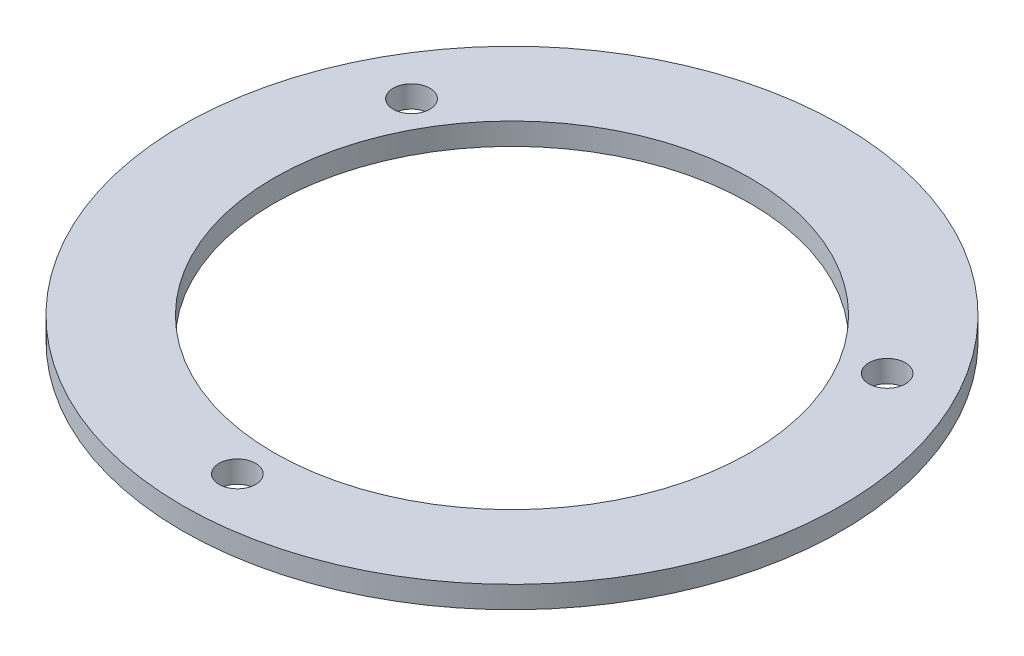
ISO-10303-21;
HEADER;
FILE_DESCRIPTION(('STEP AP214'),'2;1');
FILE_NAME('part.step','',(''),(''),'','','');
FILE_SCHEMA(('AUTOMOTIVE_DESIGN { 1 0 10303 214 1 1 1 1 }'));
ENDSEC;
DATA;
#1=APPLICATION_CONTEXT('core data for automotive mechanical design processes');
#2=APPLICATION_PROTOCOL_DEFINITION('international standard','automotive_design',2000,#1);
#3=PRODUCT_CONTEXT('',#1,'mechanical');
#4=PRODUCT('Part','Part','',(#3));
#5=PRODUCT_RELATED_PRODUCT_CATEGORY('part','',(#4));
#6=PRODUCT_DEFINITION_FORMATION('','',#4);
#7=PRODUCT_DEFINITION_CONTEXT('part definition',#1,'design');
#8=PRODUCT_DEFINITION('design','',#6,#7);
#9=PRODUCT_DEFINITION_SHAPE('','',#8);
#10=(LENGTH_UNIT() NAMED_UNIT(*) SI_UNIT(.MILLI.,.METRE.));
#11=(NAMED_UNIT(*) PLANE_ANGLE_UNIT() SI_UNIT($,.RADIAN.));
#12=(NAMED_UNIT(*) SI_UNIT($,.STERADIAN.) SOLID_ANGLE_UNIT());
#13=UNCERTAINTY_MEASURE_WITH_UNIT(LENGTH_MEASURE(1.E-05),#10,'distance_accuracy_value','');
#14=(GEOMETRIC_REPRESENTATION_CONTEXT(3) GLOBAL_UNCERTAINTY_ASSIGNED_CONTEXT((#13)) GLOBAL_UNIT_ASSIGNED_CONTEXT((#10,
#11,#12)) REPRESENTATION_CONTEXT('',''));
#15=CARTESIAN_POINT('',(0.,0.,0.));
#16=DIRECTION('',(0.,0.,1.));
#17=DIRECTION('',(1.,0.,0.));
#18=AXIS2_PLACEMENT_3D('',#15,#16,#17);
#19=CARTESIAN_POINT('',(0.,63.5,0.));
#20=DIRECTION('',(0.,-1.,0.));
#21=DIRECTION('',(0.,0.,-1.));
#22=AXIS2_PLACEMENT_3D('',#19,#20,#21);
#23=CYLINDRICAL_SURFACE('',#22,57.15);
#24=CARTESIAN_POINT('',(0.,59.69,0.));
#25=DIRECTION('',(0.,1.,0.));
#26=DIRECTION('',(0.,0.,1.));
#27=AXIS2_PLACEMENT_3D('',#24,#25,#26);
#28=CIRCLE('',#27,57.15);
#29=CARTESIAN_POINT('',(0.,59.69,57.15));
#30=VERTEX_POINT('',#29);
#31=EDGE_CURVE('E69',#30,#30,#28,.T.);
#32=ORIENTED_EDGE('',*,*,#31,.T.);
#33=EDGE_LOOP('',(#32));
#34=FACE_BOUND('',#33,.T.);
#35=CARTESIAN_POINT('',(0.,63.5,0.));
#36=DIRECTION('',(0.,1.,0.));
#37=DIRECTION('',(0.,0.,1.));
#38=AXIS2_PLACEMENT_3D('',#35,#36,#37);
#39=CIRCLE('',#38,57.15);
#40=CARTESIAN_POINT('',(0.,63.5,57.15));
#41=VERTEX_POINT('',#40);
#42=EDGE_CURVE('E11',#41,#41,#39,.T.);
#43=ORIENTED_EDGE('',*,*,#42,.F.);
#44=EDGE_LOOP('',(#43));
#45=FACE_BOUND('',#44,.T.);
#46=ADVANCED_FACE('F42',(#34,#45),#23,.T.);
#47=CARTESIAN_POINT('',(0.,63.5,0.));
#48=DIRECTION('',(0.,1.,0.));
#49=DIRECTION('',(0.,0.,1.));
#50=AXIS2_PLACEMENT_3D('',#47,#48,#49);
#51=PLANE('',#50);
#52=CARTESIAN_POINT('',(-41.2444598552339,63.5,-23.8125));
#53=DIRECTION('',(0.,1.,0.));
#54=DIRECTION('',(0.,0.,1.));
#55=AXIS2_PLACEMENT_3D('',#52,#53,#54);
#56=CIRCLE('',#55,3.17499999999999);
#57=CARTESIAN_POINT('',(-41.2444598552339,63.5,-20.6375));
#58=VERTEX_POINT('',#57);
#59=EDGE_CURVE('E65',#58,#58,#56,.T.);
#60=ORIENTED_EDGE('',*,*,#59,.F.);
#61=EDGE_LOOP('',(#60));
#62=FACE_BOUND('',#61,.T.);
#63=CARTESIAN_POINT('',(0.,63.5,47.625));
#64=DIRECTION('',(0.,1.,0.));
#65=DIRECTION('',(0.,0.,1.));
#66=AXIS2_PLACEMENT_3D('',#63,#64,#65);
#67=CIRCLE('',#66,3.17499999999999);
#68=CARTESIAN_POINT('',(0.,63.5,50.8));
#69=VERTEX_POINT('',#68);
#70=EDGE_CURVE('E61',#69,#69,#67,.T.);
#71=ORIENTED_EDGE('',*,*,#70,.F.);
#72=EDGE_LOOP('',(#71));
#73=FACE_BOUND('',#72,.T.);
#74=CARTESIAN_POINT('',(41.2444598552339,63.5,-23.8125));
#75=DIRECTION('',(0.,1.,0.));
#76=DIRECTION('',(0.,0.,1.));
#77=AXIS2_PLACEMENT_3D('',#74,#75,#76);
#78=CIRCLE('',#77,3.17499999999999);
#79=CARTESIAN_POINT('',(41.2444598552339,63.5,-20.6375));
#80=VERTEX_POINT('',#79);
#81=EDGE_CURVE('E55',#80,#80,#78,.T.);
#82=ORIENTED_EDGE('',*,*,#81,.F.);
#83=EDGE_LOOP('',(#82));
#84=FACE_BOUND('',#83,.T.);
#85=CARTESIAN_POINT('',(0.,63.5,0.));
#86=DIRECTION('',(0.,1.,0.));
#87=DIRECTION('',(0.,0.,1.));
#88=AXIS2_PLACEMENT_3D('',#85,#86,#87);
#89=CIRCLE('',#88,41.275);
#90=CARTESIAN_POINT('',(0.,63.5,41.275));
#91=VERTEX_POINT('',#90);
#92=EDGE_CURVE('E50',#91,#91,#89,.T.);
#93=ORIENTED_EDGE('',*,*,#92,.F.);
#94=EDGE_LOOP('',(#93));
#95=FACE_BOUND('',#94,.T.);
#96=ORIENTED_EDGE('',*,*,#42,.T.);
#97=EDGE_LOOP('',(#96));
#98=FACE_BOUND('',#97,.T.);
#99=ADVANCED_FACE('F104',(#62,#73,#84,#95,#98),#51,.T.);
#100=CARTESIAN_POINT('',(0.,-116.743329573899,0.));
#101=DIRECTION('',(0.,1.,0.));
#102=DIRECTION('',(0.,0.,1.));
#103=AXIS2_PLACEMENT_3D('',#100,#101,#102);
#104=CYLINDRICAL_SURFACE('',#103,41.275);
#105=CARTESIAN_POINT('',(0.,59.69,0.));
#106=DIRECTION('',(0.,1.,0.));
#107=DIRECTION('',(0.,0.,1.));
#108=AXIS2_PLACEMENT_3D('',#105,#106,#107);
#109=CIRCLE('',#108,41.275);
#110=CARTESIAN_POINT('',(0.,59.69,41.275));
#111=VERTEX_POINT('',#110);
#112=EDGE_CURVE('E73',#111,#111,#109,.F.);
#113=ORIENTED_EDGE('',*,*,#112,.T.);
#114=EDGE_LOOP('',(#113));
#115=FACE_BOUND('',#114,.T.);
#116=ORIENTED_EDGE('',*,*,#92,.T.);
#117=EDGE_LOOP('',(#116));
#118=FACE_BOUND('',#117,.T.);
#119=ADVANCED_FACE('F110',(#115,#118),#104,.F.);
#120=CARTESIAN_POINT('',(41.2444598552339,63.5,-23.8125));
#121=DIRECTION('',(0.,1.,0.));
#122=DIRECTION('',(0.,0.,1.));
#123=AXIS2_PLACEMENT_3D('',#120,#121,#122);
#124=CYLINDRICAL_SURFACE('',#123,3.17499999999999);
#125=CARTESIAN_POINT('',(41.2444598552339,59.69,-23.8125));
#126=DIRECTION('',(0.,1.,0.));
#127=DIRECTION('',(0.,0.,1.));
#128=AXIS2_PLACEMENT_3D('',#125,#126,#127);
#129=CIRCLE('',#128,3.17499999999999);
#130=CARTESIAN_POINT('',(41.2444598552339,59.69,-20.6375));
#131=VERTEX_POINT('',#130);
#132=EDGE_CURVE('E77',#131,#131,#129,.F.);
#133=ORIENTED_EDGE('',*,*,#132,.T.);
#134=EDGE_LOOP('',(#133));
#135=FACE_BOUND('',#134,.T.);
#136=ORIENTED_EDGE('',*,*,#81,.T.);
#137=EDGE_LOOP('',(#136));
#138=FACE_BOUND('',#137,.T.);
#139=ADVANCED_FACE('F115',(#135,#138),#124,.F.);
#140=CARTESIAN_POINT('',(0.,63.5,47.625));
#141=DIRECTION('',(0.,1.,0.));
#142=DIRECTION('',(0.,0.,1.));
#143=AXIS2_PLACEMENT_3D('',#140,#141,#142);
#144=CYLINDRICAL_SURFACE('',#143,3.17499999999999);
#145=CARTESIAN_POINT('',(0.,59.69,47.625));
#146=DIRECTION('',(0.,1.,0.));
#147=DIRECTION('',(0.,0.,1.));
#148=AXIS2_PLACEMENT_3D('',#145,#146,#147);
#149=CIRCLE('',#148,3.17499999999999);
#150=CARTESIAN_POINT('',(0.,59.69,50.8));
#151=VERTEX_POINT('',#150);
#152=EDGE_CURVE('E81',#151,#151,#149,.F.);
#153=ORIENTED_EDGE('',*,*,#152,.T.);
#154=EDGE_LOOP('',(#153));
#155=FACE_BOUND('',#154,.T.);
#156=ORIENTED_EDGE('',*,*,#70,.T.);
#157=EDGE_LOOP('',(#156));
#158=FACE_BOUND('',#157,.T.);
#159=ADVANCED_FACE('F123',(#155,#158),#144,.F.);
#160=CARTESIAN_POINT('',(-41.2444598552339,63.5,-23.8125));
#161=DIRECTION('',(0.,1.,0.));
#162=DIRECTION('',(0.,0.,1.));
#163=AXIS2_PLACEMENT_3D('',#160,#161,#162);
#164=CYLINDRICAL_SURFACE('',#163,3.17499999999999);
#165=CARTESIAN_POINT('',(-41.2444598552339,59.69,-23.8125));
#166=DIRECTION('',(0.,1.,0.));
#167=DIRECTION('',(0.,0.,1.));
#168=AXIS2_PLACEMENT_3D('',#165,#166,#167);
#169=CIRCLE('',#168,3.17499999999999);
#170=CARTESIAN_POINT('',(-41.2444598552339,59.69,-20.6375));
#171=VERTEX_POINT('',#170);
#172=EDGE_CURVE('E45',#171,#171,#169,.F.);
#173=ORIENTED_EDGE('',*,*,#172,.T.);
#174=EDGE_LOOP('',(#173));
#175=FACE_BOUND('',#174,.T.);
#176=ORIENTED_EDGE('',*,*,#59,.T.);
#177=EDGE_LOOP('',(#176));
#178=FACE_BOUND('',#177,.T.);
#179=ADVANCED_FACE('F90',(#175,#178),#164,.F.);
#180=CARTESIAN_POINT('',(0.,59.69,0.));
#181=DIRECTION('',(0.,1.,0.));
#182=DIRECTION('',(0.,0.,1.));
#183=AXIS2_PLACEMENT_3D('',#180,#181,#182);
#184=PLANE('',#183);
#185=ORIENTED_EDGE('',*,*,#112,.F.);
#186=EDGE_LOOP('',(#185));
#187=FACE_BOUND('',#186,.T.);
#188=ORIENTED_EDGE('',*,*,#152,.F.);
#189=EDGE_LOOP('',(#188));
#190=FACE_BOUND('',#189,.T.);
#191=ORIENTED_EDGE('',*,*,#172,.F.);
#192=EDGE_LOOP('',(#191));
#193=FACE_BOUND('',#192,.T.);
#194=ORIENTED_EDGE('',*,*,#132,.F.);
#195=EDGE_LOOP('',(#194));
#196=FACE_BOUND('',#195,.T.);
#197=ORIENTED_EDGE('',*,*,#31,.F.);
#198=EDGE_LOOP('',(#197));
#199=FACE_BOUND('',#198,.T.);
#200=ADVANCED_FACE('F93',(#187,#190,#193,#196,#199),#184,.F.);
#201=CLOSED_SHELL('',(#46,#99,#119,#139,#159,#179,#200));
#202=MANIFOLD_SOLID_BREP('B2',#201);
#203=ADVANCED_BREP_SHAPE_REPRESENTATION('',(#18,#202),#14);
#204=SHAPE_DEFINITION_REPRESENTATION(#9,#203);
ENDSEC;
END-ISO-10303-21;
